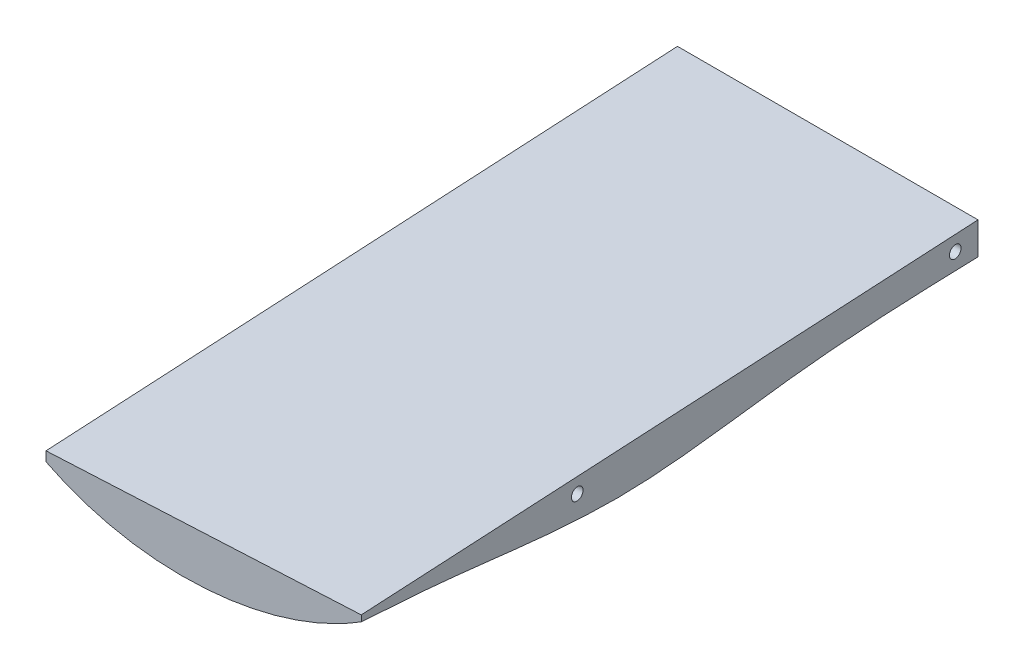
ISO-10303-21;
HEADER;
FILE_DESCRIPTION(('STEP AP214'),'2;1');
FILE_NAME('part.step','',(''),(''),'','','');
FILE_SCHEMA(('AUTOMOTIVE_DESIGN { 1 0 10303 214 1 1 1 1 }'));
ENDSEC;
DATA;
#1=APPLICATION_CONTEXT('core data for automotive mechanical design processes');
#2=APPLICATION_PROTOCOL_DEFINITION('international standard','automotive_design',2000,#1);
#3=PRODUCT_CONTEXT('',#1,'mechanical');
#4=PRODUCT('Part','Part','',(#3));
#5=PRODUCT_RELATED_PRODUCT_CATEGORY('part','',(#4));
#6=PRODUCT_DEFINITION_FORMATION('','',#4);
#7=PRODUCT_DEFINITION_CONTEXT('part definition',#1,'design');
#8=PRODUCT_DEFINITION('design','',#6,#7);
#9=PRODUCT_DEFINITION_SHAPE('','',#8);
#10=(LENGTH_UNIT() NAMED_UNIT(*) SI_UNIT(.MILLI.,.METRE.));
#11=(NAMED_UNIT(*) PLANE_ANGLE_UNIT() SI_UNIT($,.RADIAN.));
#12=(NAMED_UNIT(*) SI_UNIT($,.STERADIAN.) SOLID_ANGLE_UNIT());
#13=UNCERTAINTY_MEASURE_WITH_UNIT(LENGTH_MEASURE(1.E-05),#10,'distance_accuracy_value','');
#14=(GEOMETRIC_REPRESENTATION_CONTEXT(3) GLOBAL_UNCERTAINTY_ASSIGNED_CONTEXT((#13)) GLOBAL_UNIT_ASSIGNED_CONTEXT((#10,
#11,#12)) REPRESENTATION_CONTEXT('',''));
#15=CARTESIAN_POINT('',(0.,0.,0.));
#16=DIRECTION('',(0.,0.,1.));
#17=DIRECTION('',(1.,0.,0.));
#18=AXIS2_PLACEMENT_3D('',#15,#16,#17);
#19=CARTESIAN_POINT('',(35.8427346748158,-3.54190754826226,155.));
#20=CARTESIAN_POINT('',(35.1627526778447,-3.68514347465179,144.657982186078));
#21=CARTESIAN_POINT('',(33.7880147764098,-3.64195272906482,124.017509866304));
#22=CARTESIAN_POINT('',(30.314241494189,-3.05406172963305,93.0196051861016));
#23=CARTESIAN_POINT('',(29.4858974070119,-0.541565262780365,61.9867643142251));
#24=CARTESIAN_POINT('',(28.9585928296278,-3.02651502440856,30.9782382878208));
#25=CARTESIAN_POINT('',(30.8908482216009,-1.73391869803667,-0.00116580546392431));
#26=CARTESIAN_POINT('',(31.8951804742411,-1.35287675198569,-30.9970094182614));
#27=CARTESIAN_POINT('',(36.8141189130246,-4.09666569025635,-61.9641568609168));
#28=CARTESIAN_POINT('',(34.2834172353273,-4.63876904274589,-93.0171839677356));
#29=CARTESIAN_POINT('',(31.915203952217,-2.21704479511777,-113.734328828711));
#30=CARTESIAN_POINT('',(30.2130961084065,-0.426121435458513,-124.));
#31=CARTESIAN_POINT('',(35.8379122430388,-4.15463549946753,155.));
#32=CARTESIAN_POINT('',(35.1612340933614,-4.25417602949023,144.65817324007));
#33=CARTESIAN_POINT('',(33.7942466139428,-4.15930965899877,124.017421397679));
#34=CARTESIAN_POINT('',(30.2978104979273,-3.68417084458209,93.0196284449469));
#35=CARTESIAN_POINT('',(29.5254841303272,-1.23414851673452,61.9867595991212));
#36=CARTESIAN_POINT('',(28.9318746057494,-3.8033975346619,30.9782338761082));
#37=CARTESIAN_POINT('',(30.9126553470235,-2.61239013705044,-0.00114340155636377));
#38=CARTESIAN_POINT('',(31.9602453226888,-2.2593410670807,-30.9970946157675));
#39=CARTESIAN_POINT('',(36.819364156405,-5.09675061514111,-61.9638388881608));
#40=CARTESIAN_POINT('',(34.2621958190516,-5.55858362277206,-93.0183691821437));
#41=CARTESIAN_POINT('',(31.9282831337774,-3.20254926132649,-113.73176900778));
#42=CARTESIAN_POINT('',(30.2530375907749,-1.45383942767095,-124.));
#43=CARTESIAN_POINT('',(35.7578455538799,-5.36785163974602,155.));
#44=CARTESIAN_POINT('',(35.0866462414737,-5.38042763031314,144.65855016562));
#45=CARTESIAN_POINT('',(33.7329163681328,-5.1853268329877,124.017246867108));
#46=CARTESIAN_POINT('',(30.1913829249364,-4.93155169219905,93.0196743075292));
#47=CARTESIAN_POINT('',(29.5264106303809,-2.61060175832749,61.9867503866196));
#48=CARTESIAN_POINT('',(28.7970167939569,-5.34024721932651,30.9782248368355));
#49=CARTESIAN_POINT('',(30.8663872995961,-4.35520798728201,-0.0010979474740641));
#50=CARTESIAN_POINT('',(31.993125211566,-4.06085784553073,-30.9972673797487));
#51=CARTESIAN_POINT('',(36.7244299012955,-7.08011266468958,-61.9631941244981));
#52=CARTESIAN_POINT('',(34.1127201653266,-7.37928066578461,-93.0207724736001));
#53=CARTESIAN_POINT('',(31.8489158436014,-5.15554159371352,-113.726578390445));
#54=CARTESIAN_POINT('',(30.2299725203858,-3.49391307422487,-124.));
#55=CARTESIAN_POINT('',(35.4346511755766,-7.1453058951382,155.));
#56=CARTESIAN_POINT('',(34.768156589362,-7.03222109429824,144.659076456229));
#57=CARTESIAN_POINT('',(33.4280732208492,-6.69188713354031,124.017003198801));
#58=CARTESIAN_POINT('',(29.8196845372562,-6.75870690150582,93.0197382608096));
#59=CARTESIAN_POINT('',(29.30162917273,-4.64206488458172,61.9867378328055));
#60=CARTESIAN_POINT('',(28.3601505599028,-7.58779227086423,30.9782110598405));
#61=CARTESIAN_POINT('',(30.5374627522916,-6.9185830772304,-0.00103016178208137));
#62=CARTESIAN_POINT('',(31.7610895525783,-6.71966900715749,-30.9975247257979));
#63=CARTESIAN_POINT('',(36.2780794691328,-9.99551352097931,-61.9622337744127));
#64=CARTESIAN_POINT('',(33.5791070534056,-10.0437329265352,-93.0243520607695));
#65=CARTESIAN_POINT('',(31.4271996897202,-8.02467718861711,-113.718847219021));
#66=CARTESIAN_POINT('',(29.8979344610096,-6.49786328244929,-124.));
#67=CARTESIAN_POINT('',(34.9165335849583,-8.87473952687532,155.));
#68=CARTESIAN_POINT('',(34.2513560601391,-8.64028224655301,144.659554794846));
#69=CARTESIAN_POINT('',(32.9187989132671,-8.16146354042803,124.016781760941));
#70=CARTESIAN_POINT('',(29.2446006435911,-8.53604601241197,93.0197962855277));
#71=CARTESIAN_POINT('',(28.8592360759079,-6.63336493611029,61.9867267997543));
#72=CARTESIAN_POINT('',(27.6983978333539,-9.77059821007916,30.9781971298423));
#73=CARTESIAN_POINT('',(29.9591164006536,-9.42260368594222,-0.000963288906382638));
#74=CARTESIAN_POINT('',(31.258178862561,-9.32591867234625,-30.9977782675884));
#75=CARTESIAN_POINT('',(35.5397832106495,-12.8415563417304,-61.9612877099571));
#76=CARTESIAN_POINT('',(32.7489929280319,-12.6336496499087,-93.027878376228));
#77=CARTESIAN_POINT('',(30.7141388140568,-10.8231505676935,-113.711231107797));
#78=CARTESIAN_POINT('',(29.2798595994272,-9.43557998107364,-124.));
#79=CARTESIAN_POINT('',(30.6873155608603,-18.9293135635908,155.));
#80=CARTESIAN_POINT('',(30.0110030689528,-17.9962810735418,144.662205941936));
#81=CARTESIAN_POINT('',(28.6868187856497,-16.7267014182124,124.015554606319));
#82=CARTESIAN_POINT('',(24.6258783455123,-18.8666401384387,93.0201173787256));
#83=CARTESIAN_POINT('',(24.9505518208412,-18.298284965522,61.9866675180937));
#84=CARTESIAN_POINT('',(22.4367086609945,-22.4369800911767,30.9781129452956));
#85=CARTESIAN_POINT('',(25.053172867069,-24.0396530128959,-0.000566569112756719));
#86=CARTESIAN_POINT('',(26.6781138376736,-24.593146633283,-30.9992808440941));
#87=CARTESIAN_POINT('',(29.431221401857,-29.444563693327,-61.9556814115166));
#88=CARTESIAN_POINT('',(26.0634458780859,-27.6738308593843,-93.0487749165118));
#89=CARTESIAN_POINT('',(24.7626430641856,-27.1377788346257,-113.666098927189));
#90=CARTESIAN_POINT('',(23.9236115262114,-26.6040396272576,-124.));
#91=CARTESIAN_POINT('',(18.0914051072497,-25.5679590364641,155.));
#92=CARTESIAN_POINT('',(17.232825139579,-24.2156509058627,144.659597332812));
#93=CARTESIAN_POINT('',(15.6635832143728,-22.56145812675,124.016765028065));
#94=CARTESIAN_POINT('',(11.3001360733182,-25.6656174263986,93.0197911024135));
#95=CARTESIAN_POINT('',(11.6026575923168,-26.7087709690945,61.9867642010609));
#96=CARTESIAN_POINT('',(7.56884931317433,-30.6067826689803,30.9780524941291));
#97=CARTESIAN_POINT('',(9.37915809323674,-34.1667863806854,-0.000421401284486222));
#98=CARTESIAN_POINT('',(10.3145348593972,-35.6028435805808,-30.9998009985907));
#99=CARTESIAN_POINT('',(10.7578432540208,-40.85331256738,-61.9537484724272));
#100=CARTESIAN_POINT('',(6.70459549505113,-37.5051537947056,-93.0559775362772));
#101=CARTESIAN_POINT('',(6.2117993839457,-38.1883646280861,-113.650543141512));
#102=CARTESIAN_POINT('',(6.18604525358706,-38.6580590239778,-124.));
#103=CARTESIAN_POINT('',(-13.1751994720926,-25.2519318340484,155.));
#104=CARTESIAN_POINT('',(-14.4928220309325,-24.1100807881853,144.668342308697));
#105=CARTESIAN_POINT('',(-17.0125124288873,-22.8419752111193,124.012711461055));
#106=CARTESIAN_POINT('',(-21.4556354493319,-25.2773778653865,93.02087024127));
#107=CARTESIAN_POINT('',(-22.7635399151617,-28.6100869765786,61.986494465896));
#108=CARTESIAN_POINT('',(-28.7585158132102,-29.5891445412055,30.9780519833091));
#109=CARTESIAN_POINT('',(-30.2913873922654,-35.2350820588258,-0.00014873554086977));
#110=CARTESIAN_POINT('',(-32.2766559710149,-38.0880614379352,-31.0008911129428));
#111=CARTESIAN_POINT('',(-35.9026874663514,-41.8042082258472,-61.9496659908204));
#112=CARTESIAN_POINT('',(-41.0932728847451,-36.5550300750589,-93.0711983423471));
#113=CARTESIAN_POINT('',(-40.1246305535144,-38.9134863798661,-113.617668641055));
#114=CARTESIAN_POINT('',(-39.1298828653632,-40.4192282918993,-124.));
#115=CARTESIAN_POINT('',(-27.199405109194,-15.1602430058688,155.));
#116=CARTESIAN_POINT('',(-28.8227905014613,-14.8980451402706,144.683109718443));
#117=CARTESIAN_POINT('',(-31.8310522331261,-14.5330501655138,124.005864470315));
#118=CARTESIAN_POINT('',(-35.9686035728145,-14.8802305060615,93.0226989829466));
#119=CARTESIAN_POINT('',(-38.9054169810742,-18.2193372994629,61.9860151161056));
#120=CARTESIAN_POINT('',(-44.7100676174267,-16.5163081154681,30.9781402435583));
#121=CARTESIAN_POINT('',(-48.5388964368377,-21.4522634594427,-2.13854617520809E-05));
#122=CARTESIAN_POINT('',(-52.541680958005,-24.4916147606981,-31.0014888227997));
#123=CARTESIAN_POINT('',(-57.0405424176506,-25.9895790404722,-61.9474054462964));
#124=CARTESIAN_POINT('',(-62.2817689903941,-21.2084256965811,-93.0796322620442));
#125=CARTESIAN_POINT('',(-61.2921357370959,-23.2008902341755,-113.59945167089));
#126=CARTESIAN_POINT('',(-60.2177569634773,-24.526053889533,-124.));
#127=CARTESIAN_POINT('',(-27.0065078381165,9.34887504234193,155.));
#128=CARTESIAN_POINT('',(-28.7479835050662,8.03975050873394,144.684747742096));
#129=CARTESIAN_POINT('',(-32.0868523229509,6.07939228859313,124.005102716381));
#130=CARTESIAN_POINT('',(-35.3096014614367,10.3459994164792,93.0229097821866));
#131=CARTESIAN_POINT('',(-40.4894191387344,9.47823039578965,61.9859324352675));
#132=CARTESIAN_POINT('',(-43.6409679810289,14.5601722576259,30.9782602852745));
#133=CARTESIAN_POINT('',(-49.4121314320725,13.6876485154943,-0.000419321419992106));
#134=CARTESIAN_POINT('',(-55.14084607463,11.7615594746781,-31.000017266097));
#135=CARTESIAN_POINT('',(-57.2631008964266,14.0343302732412,-61.9528866139599));
#136=CARTESIAN_POINT('',(-61.3854054357999,15.5076024229043,-93.0592046325641));
#137=CARTESIAN_POINT('',(-61.9179058916334,16.3846492180172,-113.64357065152));
#138=CARTESIAN_POINT('',(-61.8154162582166,16.5826657989647,-124.));
#139=CARTESIAN_POINT('',(-12.8256940815717,19.1554816400401,155.));
#140=CARTESIAN_POINT('',(-14.3794971897764,17.1546878874907,144.671618356002));
#141=CARTESIAN_POINT('',(-17.4656788347286,14.6422203711915,124.011187953189));
#142=CARTESIAN_POINT('',(-20.2643945810951,20.3927309188514,93.0212918397498));
#143=CARTESIAN_POINT('',(-25.6326953299893,21.5840382585756,61.9863291042197));
#144=CARTESIAN_POINT('',(-26.82207802381,26.7155431439095,30.9782920667415));
#145=CARTESIAN_POINT('',(-31.8718924010995,28.4321300624706,-0.000944607457347031));
#146=CARTESIAN_POINT('',(-36.9921218538255,27.6074536873767,-30.9979479995374));
#147=CARTESIAN_POINT('',(-36.2832174240912,30.6784920919938,-61.9606283261474));
#148=CARTESIAN_POINT('',(-39.5538330002091,30.102417845161,-93.0303430833869));
#149=CARTESIAN_POINT('',(-41.0756082881029,32.5239395084448,-113.705906602314));
#150=CARTESIAN_POINT('',(-42.0246388803553,34.0645580690216,-124.));
#151=CARTESIAN_POINT('',(18.4409104977706,18.8394544376244,155.));
#152=CARTESIAN_POINT('',(17.3399803275693,16.9740913441582,144.656834301682));
#153=CARTESIAN_POINT('',(15.2132798577956,14.9575250299903,124.01804013556));
#154=CARTESIAN_POINT('',(12.4906043315148,19.9951963084886,93.0194698646857));
#155=CARTESIAN_POINT('',(8.73373429456203,23.487804662086,61.9867762351576));
#156=CARTESIAN_POINT('',(9.50513123580112,25.6974004171582,30.9783260951987));
#157=CARTESIAN_POINT('',(7.79904460964687,29.4999887383663,-0.0015295223582621));
#158=CARTESIAN_POINT('',(5.59765891401819,30.0949244744353,-30.995642474396));
#159=CARTESIAN_POINT('',(10.3825552111577,31.6208241984226,-61.969254293763));
#160=CARTESIAN_POINT('',(8.22450214332878,29.1842553960001,-92.9981848871404));
#161=CARTESIAN_POINT('',(5.30300845642453,33.1800240101548,-113.775362756683));
#162=CARTESIAN_POINT('',(3.29128923859487,35.8257273369431,-124.));
#163=CARTESIAN_POINT('',(30.9303274301597,11.9472590209008,155.));
#164=CARTESIAN_POINT('',(30.0867219173147,10.6673470565356,144.653195838053));
#165=CARTESIAN_POINT('',(28.3731581158383,9.34905904961438,124.019726529547));
#166=CARTESIAN_POINT('',(25.4537675305107,12.8844351785463,93.0190213867381));
#167=CARTESIAN_POINT('',(22.9557300374721,16.6027143751478,61.9868865615673));
#168=CARTESIAN_POINT('',(23.7830681528223,16.7115931136574,30.9783334079898));
#169=CARTESIAN_POINT('',(23.9543357891842,20.2281865547234,-0.00166950551863694));
#170=CARTESIAN_POINT('',(23.3991238601176,21.0857446068253,-30.9950898792864));
#171=CARTESIAN_POINT('',(29.1678095923344,20.9503161704363,-61.9713220019487));
#172=CARTESIAN_POINT('',(27.1294573711835,18.6825799467348,-92.9904762737712));
#173=CARTESIAN_POINT('',(24.1108520771063,22.5126453644955,-113.792012041356));
#174=CARTESIAN_POINT('',(21.9108812809911,25.1847013964155,-124.));
#175=CARTESIAN_POINT('',(35.0006176051836,1.80879770595725,155.));
#176=CARTESIAN_POINT('',(34.2775216582262,1.27717800295542,144.656297125633));
#177=CARTESIAN_POINT('',(32.8102854944179,0.861131458024565,124.018290207689));
#178=CARTESIAN_POINT('',(29.5310526154605,2.45002886467455,93.0193998213985));
#179=CARTESIAN_POINT('',(28.1690132344922,5.44266812407294,61.9868067393754));
#180=CARTESIAN_POINT('',(28.1642482132528,3.77511363932708,30.9782740644777));
#181=CARTESIAN_POINT('',(29.5789113380691,5.89441578140652,-0.00135169119266476));
#182=CARTESIAN_POINT('',(30.1236182439897,6.47934643158998,-30.9963017045752));
#183=CARTESIAN_POINT('',(35.448656483217,4.59543426479071,-61.9667983959258));
#184=CARTESIAN_POINT('',(33.1177823088361,3.40616278703331,-93.0073378292235));
#185=CARTESIAN_POINT('',(30.4887414009784,6.35600786229482,-113.755594486328));
#186=CARTESIAN_POINT('',(28.5834390865734,8.48373219173645,-124.));
#187=CARTESIAN_POINT('',(35.491432166004,0.06916629260821,155.));
#188=CARTESIAN_POINT('',(34.7858309120324,-0.334971455850413,144.656834954274));
#189=CARTESIAN_POINT('',(33.3547930148483,-0.599077144150035,124.018041131195));
#190=CARTESIAN_POINT('',(30.0131229576796,0.660078002559681,93.0194654080247));
#191=CARTESIAN_POINT('',(28.8355292482874,3.51274076275009,61.98679305209));
#192=CARTESIAN_POINT('',(28.6747343323762,1.55947475458338,30.9782631918696));
#193=CARTESIAN_POINT('',(30.280713724203,3.42482826003675,-0.00129440330500312));
#194=CARTESIAN_POINT('',(30.9949366498529,3.95344419683371,-30.9965199674317));
#195=CARTESIAN_POINT('',(36.2165311281582,1.77950485105571,-61.965983691515));
#196=CARTESIAN_POINT('',(33.8281891826456,0.787714417747922,-93.0103745941404));
#197=CARTESIAN_POINT('',(31.2748988775122,3.5763380002292,-113.749035689507));
#198=CARTESIAN_POINT('',(29.4276495439955,5.60284610591571,-124.));
#199=CARTESIAN_POINT('',(35.7865986987834,-1.71453804562608,155.));
#200=CARTESIAN_POINT('',(35.0955763026155,-1.98928641439416,144.65740384167));
#201=CARTESIAN_POINT('',(33.6958175118038,-2.09988870001354,124.017777678858));
#202=CARTESIAN_POINT('',(30.2893350857342,-1.17480875780901,93.0195347544575));
#203=CARTESIAN_POINT('',(29.2903845349913,1.51889271462072,61.9867786772427));
#204=CARTESIAN_POINT('',(28.9563173298102,-0.708193523111859,30.9782513071107));
#205=CARTESIAN_POINT('',(30.7363743719684,0.882557587657773,-0.00123237091941341));
#206=CARTESIAN_POINT('',(31.6051504426317,1.34387387831209,-30.9967561947125));
#207=CARTESIAN_POINT('',(36.6932813760123,-1.11742870692895,-61.9651019610341));
#208=CARTESIAN_POINT('',(34.2387822268579,-1.89426622722135,-93.0136611871519));
#209=CARTESIAN_POINT('',(31.7719435671115,0.718816938458442,-113.741937316033));
#210=CARTESIAN_POINT('',(29.9918264390473,2.6337266139694,-124.));
#211=CARTESIAN_POINT('',(35.8475571065927,-2.92917959705699,155.));
#212=CARTESIAN_POINT('',(35.164271262328,-3.11611091981335,144.657791132086));
#213=CARTESIAN_POINT('',(33.7817829388768,-3.12459579913088,124.017598334929));
#214=CARTESIAN_POINT('',(30.3306724904507,-2.423952614684,93.0195819272563));
#215=CARTESIAN_POINT('',(29.4463106836965,0.151017991173795,61.9867690293289));
#216=CARTESIAN_POINT('',(28.9853110535062,-2.24963251415523,30.9782426995333));
#217=CARTESIAN_POINT('',(30.8690410961782,-0.855447259022891,-0.00118820937148485));
#218=CARTESIAN_POINT('',(31.8301156257933,-0.446412436890691,-30.9969242207554));
#219=CARTESIAN_POINT('',(36.8088736696442,-3.0965807653716,-61.9644748336728));
#220=CARTESIAN_POINT('',(34.3046386516031,-3.71895446271972,-93.0159987533276));
#221=CARTESIAN_POINT('',(31.9021247706566,-1.23154032890905,-113.736888649643));
#222=CARTESIAN_POINT('',(30.173154626038,0.601596556753926,-124.));
#223=CARTESIAN_POINT('',(35.8427346748158,-3.54190754826226,155.));
#224=CARTESIAN_POINT('',(35.1627526778447,-3.68514347465179,144.657982186078));
#225=CARTESIAN_POINT('',(33.7880147764098,-3.64195272906482,124.017509866304));
#226=CARTESIAN_POINT('',(30.314241494189,-3.05406172963305,93.0196051861016));
#227=CARTESIAN_POINT('',(29.4858974070119,-0.541565262780365,61.9867643142251));
#228=CARTESIAN_POINT('',(28.9585928296278,-3.02651502440856,30.9782382878208));
#229=CARTESIAN_POINT('',(30.8908482216009,-1.73391869803667,-0.00116580546392431));
#230=CARTESIAN_POINT('',(31.8951804742411,-1.35287675198569,-30.9970094182614));
#231=CARTESIAN_POINT('',(36.8141189130246,-4.09666569025635,-61.9641568609168));
#232=CARTESIAN_POINT('',(34.2834172353273,-4.63876904274589,-93.0171839677356));
#233=CARTESIAN_POINT('',(31.915203952217,-2.21704479511777,-113.734328828711));
#234=CARTESIAN_POINT('',(30.2130961084065,-0.426121435458513,-124.));
#235=B_SPLINE_SURFACE_WITH_KNOTS('',3,3,((#19,#20,#21,#22,#23,#24,#25,#26,#27,#28,#29,#30),(#31,
#32,#33,#34,#35,#36,#37,#38,#39,#40,#41,#42),(#43,#44,#45,#46,#47,#48,#49,#50,#51,#52,#53,#54),
(#55,#56,#57,#58,#59,#60,#61,#62,#63,#64,#65,#66),(#67,#68,#69,#70,#71,#72,#73,#74,#75,#76,#77,
#78),(#79,#80,#81,#82,#83,#84,#85,#86,#87,#88,#89,#90),(#91,#92,#93,#94,#95,#96,#97,#98,#99,
#100,#101,#102),(#103,#104,#105,#106,#107,#108,#109,#110,#111,#112,#113,#114),(#115,#116,#117,
#118,#119,#120,#121,#122,#123,#124,#125,#126),(#127,#128,#129,#130,#131,#132,#133,#134,#135,
#136,#137,#138),(#139,#140,#141,#142,#143,#144,#145,#146,#147,#148,#149,#150),(#151,#152,#153,
#154,#155,#156,#157,#158,#159,#160,#161,#162),(#163,#164,#165,#166,#167,#168,#169,#170,#171,
#172,#173,#174),(#175,#176,#177,#178,#179,#180,#181,#182,#183,#184,#185,#186),(#187,#188,#189,
#190,#191,#192,#193,#194,#195,#196,#197,#198),(#199,#200,#201,#202,#203,#204,#205,#206,#207,
#208,#209,#210),(#211,#212,#213,#214,#215,#216,#217,#218,#219,#220,#221,#222),(#223,#224,#225,
#226,#227,#228,#229,#230,#231,#232,#233,#234)),.UNSPECIFIED.,.T.,.F.,.F.,(4,1,1,1,1,2,2,2,1,1,1,
1,4),(4,1,1,1,1,1,1,1,1,4),(0.,0.0125,0.0249999999999999,0.0375000000000001,0.05,0.25,0.5,0.75,
0.95,0.9625,0.975,0.9875,1.),(0.,0.111186009309614,0.22227899560327,0.333246583960217,
0.444296507320463,0.555487388383461,0.666700226573109,0.77787064216206,0.888814058395876,1.),.UNSPECIFIED.);
#236=CARTESIAN_POINT('',(15.3073302178123,-28.5967891890633,-14.6365276553906));
#237=CARTESIAN_POINT('',(15.2123436249481,-28.7990278504998,-16.4668833844653));
#238=CARTESIAN_POINT('',(15.1173704537612,-29.0046389443827,-18.2969804828953));
#239=CARTESIAN_POINT('',(14.9274453542363,-29.4327886362347,-21.9567653380878));
#240=CARTESIAN_POINT('',(14.8324935130789,-29.6553415198714,-23.7864514149151));
#241=CARTESIAN_POINT('',(14.7059939628873,-29.9699839833801,-26.2240499163124));
#242=CARTESIAN_POINT('',(14.674367196046,-30.0501642132366,-26.8334857549363));
#243=CARTESIAN_POINT('',(14.6111368846187,-30.2138573534635,-28.0519099481024));
#244=CARTESIAN_POINT('',(14.5795333399938,-30.2973702582225,-28.6608983033963));
#245=CARTESIAN_POINT('',(14.5163533773461,-30.4680974630276,-29.8783522946171));
#246=CARTESIAN_POINT('',(14.484776959052,-30.5553117255964,-30.486817935773));
#247=CARTESIAN_POINT('',(14.4216455753244,-30.73376592947,-31.7033358295715));
#248=CARTESIAN_POINT('',(14.3900906185308,-30.8250070070744,-32.3113879157277));
#249=CARTESIAN_POINT('',(14.3270038840662,-31.0104490752208,-33.5270454351115));
#250=CARTESIAN_POINT('',(14.2954721066085,-31.1046500926638,-34.1346508642284));
#251=CARTESIAN_POINT('',(14.2324246185276,-31.2950454421691,-35.3495521206381));
#252=CARTESIAN_POINT('',(14.2009089079861,-31.3912397842771,-35.9568479463547));
#253=CARTESIAN_POINT('',(14.0748783894189,-31.7780117086894,-38.3854083856975));
#254=CARTESIAN_POINT('',(13.9803971746967,-32.0726721567124,-40.2060256690669));
#255=CARTESIAN_POINT('',(13.8543594371205,-32.4547899552243,-42.6347252159822));
#256=CARTESIAN_POINT('',(13.8228613778945,-32.5493735970028,-43.2416809075234));
#257=CARTESIAN_POINT('',(13.7598438701894,-32.7358535421115,-44.4560044534282));
#258=CARTESIAN_POINT('',(13.7283244217264,-32.8277498474778,-45.0633723074793));
#259=CARTESIAN_POINT('',(13.665257734146,-33.0079406429474,-46.278643530984));
#260=CARTESIAN_POINT('',(13.6337104949845,-33.0962351273252,-46.8865469012874));
#261=CARTESIAN_POINT('',(13.5705201977762,-33.2684813850598,-48.1042000355833));
#262=CARTESIAN_POINT('',(13.5388770738342,-33.3524241899138,-48.7139510693522));
#263=CARTESIAN_POINT('',(13.4755530797552,-33.5148596038761,-49.9341804917945));
#264=CARTESIAN_POINT('',(13.4438722095565,-33.5933522040548,-50.5446588816578));
#265=CARTESIAN_POINT('',(13.3804692755264,-33.7439666376136,-51.7664094471109));
#266=CARTESIAN_POINT('',(13.3487472112149,-33.8160883960644,-52.3776816319509));
#267=CARTESIAN_POINT('',(13.2853345637197,-33.9528756642831,-53.5996193722025));
#268=CARTESIAN_POINT('',(13.2536440793399,-34.0175581518336,-54.2102830237008));
#269=CARTESIAN_POINT('',(13.1902209875413,-34.1387394322322,-55.4324220217308));
#270=CARTESIAN_POINT('',(13.1584883802374,-34.1952382473546,-56.0438973660486));
#271=CARTESIAN_POINT('',(13.0949831688082,-34.2991261694017,-57.2676187783095));
#272=CARTESIAN_POINT('',(13.0632105650202,-34.346515352647,-57.8798648397522));
#273=CARTESIAN_POINT('',(12.9996851252348,-34.4311963404028,-59.1039760447886));
#274=CARTESIAN_POINT('',(12.9679323527028,-34.4685057520173,-59.715839965427));
#275=CARTESIAN_POINT('',(12.9043970391179,-34.5321885972351,-60.9401414348453));
#276=CARTESIAN_POINT('',(12.8726144980875,-34.5585620390847,-61.5525789831923));
#277=CARTESIAN_POINT('',(12.8090297545534,-34.5995962101192,-62.777832949043));
#278=CARTESIAN_POINT('',(12.777227552407,-34.6142571462599,-63.3906493596609));
#279=CARTESIAN_POINT('',(12.7136101703095,-34.6330369281139,-64.6165322582871));
#280=CARTESIAN_POINT('',(12.6817949891013,-34.6371541057282,-65.2295987705204));
#281=CARTESIAN_POINT('',(12.6181643897724,-34.6358898592653,-66.455736360197));
#282=CARTESIAN_POINT('',(12.5863489716758,-34.6305081365628,-67.0688074371779));
#283=CARTESIAN_POINT('',(12.5227249040562,-34.6113190978271,-68.294819163288));
#284=CARTESIAN_POINT('',(12.4909162546037,-34.5975116978068,-68.9077598110561));
#285=CARTESIAN_POINT('',(12.4272708711936,-34.5625022619813,-70.1341822843895));
#286=CARTESIAN_POINT('',(12.3954341509313,-34.5412911346608,-70.7476638460493));
#287=CARTESIAN_POINT('',(12.3317746344827,-34.4925210487403,-71.97435865769));
#288=CARTESIAN_POINT('',(12.2999518380151,-34.4649622249296,-72.5875719130911));
#289=CARTESIAN_POINT('',(12.2363200889219,-34.4045211679363,-73.8137316582918));
#290=CARTESIAN_POINT('',(12.2045111362486,-34.3716389532575,-74.4266781490111));
#291=CARTESIAN_POINT('',(12.1408833308345,-34.3015326012691,-75.652761901007));
#292=CARTESIAN_POINT('',(12.1090644873409,-34.2643053685546,-76.2658989840931));
#293=CARTESIAN_POINT('',(12.0454378196399,-34.1865195528949,-77.4919608127868));
#294=CARTESIAN_POINT('',(12.0136299954371,-34.1459609685848,-78.1048855583073));
#295=CARTESIAN_POINT('',(11.9500226301744,-34.0624880178718,-79.3305754363146));
#296=CARTESIAN_POINT('',(11.9182230891355,-34.0195736455405,-79.9433405683959));
#297=CARTESIAN_POINT('',(11.8239606588337,-33.8902913510483,-81.7597419587092));
#298=CARTESIAN_POINT('',(11.7615051738463,-33.8019344694502,-82.9632355393487));
#299=CARTESIAN_POINT('',(11.6678158766262,-33.6707737520189,-84.7685928718836));
#300=CARTESIAN_POINT('',(11.6365846342392,-33.6272819764195,-85.3704071038249));
#301=CARTESIAN_POINT('',(11.5741170785291,-33.5416503557116,-86.5741332827268));
#302=CARTESIAN_POINT('',(11.5428807651977,-33.499510512858,-87.1760452298488));
#303=CARTESIAN_POINT('',(11.4804039826516,-33.4174870226274,-88.3799492063909));
#304=CARTESIAN_POINT('',(11.4491635144195,-33.3776030986196,-88.9819412168794));
#305=CARTESIAN_POINT('',(11.386672211277,-33.3009811634495,-90.1861249998231));
#306=CARTESIAN_POINT('',(11.355421376391,-33.2642431450071,-90.7883167718129));
#307=CARTESIAN_POINT('',(11.2929118907305,-33.19485621691,-91.9928509250044));
#308=CARTESIAN_POINT('',(11.261653241722,-33.1622067210269,-92.5951932721776));
#309=CARTESIAN_POINT('',(11.1991231761708,-33.1018179193631,-93.8001239920833));
#310=CARTESIAN_POINT('',(11.167851759627,-33.0740786139722,-94.4027123648353));
#311=CARTESIAN_POINT('',(11.1052996650847,-33.0231585640335,-95.6080675750683));
#312=CARTESIAN_POINT('',(11.07401898729,-32.9999777257197,-96.2108344086229));
#313=CARTESIAN_POINT('',(11.0114498392578,-32.9579149636817,-97.4165182331585));
#314=CARTESIAN_POINT('',(10.980161369006,-32.93903304793,-98.0194352244159));
#315=CARTESIAN_POINT('',(10.9175761858153,-32.9052901188857,-99.2254280403923));
#316=CARTESIAN_POINT('',(10.8862794724235,-32.8904294198187,-99.8285038738399));
#317=CARTESIAN_POINT('',(10.82368194232,-32.8644656405359,-101.034734610158));
#318=CARTESIAN_POINT('',(10.792381125612,-32.8533625569701,-101.637889512958));
#319=CARTESIAN_POINT('',(10.6984496347452,-32.8252872708061,-103.44791382549));
#320=CARTESIAN_POINT('',(10.6358146360684,-32.8135619417547,-104.654866567048));
#321=CARTESIAN_POINT('',(10.5105209899299,-32.8020408849127,-107.069227753308));
#322=CARTESIAN_POINT('',(10.4478623416511,-32.8022492036973,-108.276636213756));
#323=CARTESIAN_POINT('',(10.3225096527301,-32.8125947602154,-110.69213513211));
#324=CARTESIAN_POINT('',(10.2598156135588,-32.8227379922235,-111.900225561674));
#325=CARTESIAN_POINT('',(10.1343807102009,-32.8509771286306,-114.317308721139));
#326=CARTESIAN_POINT('',(10.0716398501754,-32.869079603949,-115.526301370858));
#327=CARTESIAN_POINT('',(9.94609987356027,-32.9112625009926,-117.94540925227));
#328=CARTESIAN_POINT('',(9.88330076266146,-32.9353489874692,-119.155524374302));
#329=CARTESIAN_POINT('',(9.75763257259972,-32.9874862787753,-121.577102880322));
#330=CARTESIAN_POINT('',(9.69476349855764,-33.0155417400145,-122.788566165633));
#331=CARTESIAN_POINT('',(9.63189595287463,-33.0445474254916,-124.));
#332=B_SPLINE_CURVE_WITH_KNOTS('',3,(#236,#237,#238,#239,#240,#241,#242,#243,#244,#245,#246,
#247,#248,#249,#250,#251,#252,#253,#254,#255,#256,#257,#258,#259,#260,#261,#262,#263,#264,#265,
#266,#267,#268,#269,#270,#271,#272,#273,#274,#275,#276,#277,#278,#279,#280,#281,#282,#283,#284,
#285,#286,#287,#288,#289,#290,#291,#292,#293,#294,#295,#296,#297,#298,#299,#300,#301,#302,#303,
#304,#305,#306,#307,#308,#309,#310,#311,#312,#313,#314,#315,#316,#317,#318,#319,#320,#321,#322,
#323,#324,#325,#326,#327,#328,#329,#330,#331),.UNSPECIFIED.,.F.,.F.,(4,2,2,2,2,2,2,2,2,2,2,2,2,
2,2,2,2,2,2,2,2,2,2,2,2,2,2,2,2,2,2,2,2,2,2,2,2,2,2,2,2,2,2,2,2,2,2,4),(0.,5.53201248736777,
11.0687424835384,12.9152352991277,14.7617250058967,16.608196020888,18.4551914526923,
20.3022036755242,22.1492252089298,27.6893800735708,29.5346396798062,31.3798978878981,
33.2251590290954,35.0740831400125,36.9230102801752,38.7719591632153,40.6166009652106,
42.4612377463431,44.3058590724208,46.1472371136774,47.98861376642,49.8299578819733,
51.6715932935094,53.513286603196,55.3549982711796,57.1989794987062,59.0429215740706,
60.8868572401649,62.7321146435758,64.5773728029671,66.4226356060834,70.0476757140286,
71.8602497409291,73.6728267909914,75.4851810908434,77.2975311966059,79.1096211422282,
80.9217112317122,82.7337640432513,84.5458202152028,86.3580179438168,88.1702140568187,
91.7960374541293,95.4230903375562,99.052332968595,102.684577439084,106.320518288506,
109.960760762921),.UNSPECIFIED.);
#333=CARTESIAN_POINT('',(15.2557711875427,-28.7069458493462,-15.6300506736802));
#334=VERTEX_POINT('',#333);
#335=CARTESIAN_POINT('',(9.63188972473615,-33.0487789764766,-124.));
#336=VERTEX_POINT('',#335);
#337=EDGE_CURVE('E12',#334,#336,#332,.T.);
#338=CARTESIAN_POINT('',(-34.6770364752115,-29.2871604394805,-13.0387732060134));
#339=CARTESIAN_POINT('',(-33.9126724173493,-29.7363664286074,-13.0784347997075));
#340=CARTESIAN_POINT('',(-33.1340299955951,-30.1609160756918,-13.1188376565536));
#341=CARTESIAN_POINT('',(-31.5528509270426,-30.9607451601901,-13.2008839347595));
#342=CARTESIAN_POINT('',(-30.7503387833589,-31.3360731202271,-13.242526083965));
#343=CARTESIAN_POINT('',(-29.1247486129555,-32.0383056241245,-13.3268782122711));
#344=CARTESIAN_POINT('',(-28.3016756892033,-32.3652220463745,-13.369587926415));
#345=CARTESIAN_POINT('',(-26.6425345349834,-32.9696433233155,-13.4556823198043));
#346=CARTESIAN_POINT('',(-25.8065568294563,-33.2473977564255,-13.4990622983565));
#347=CARTESIAN_POINT('',(-24.1203473065697,-33.7561242153917,-13.5865625160307));
#348=CARTESIAN_POINT('',(-23.2701123640461,-33.9870858352714,-13.6306829174539));
#349=CARTESIAN_POINT('',(-21.5583946377625,-34.4026528190505,-13.7195079650635));
#350=CARTESIAN_POINT('',(-20.6969113091544,-34.5872559286134,-13.764212639551));
#351=CARTESIAN_POINT('',(-18.9690061108341,-34.9099220097792,-13.8538788133132));
#352=CARTESIAN_POINT('',(-18.1026194582002,-35.0481745160445,-13.8988384827994));
#353=CARTESIAN_POINT('',(-16.3639574395092,-35.2796857747067,-13.9890639380074));
#354=CARTESIAN_POINT('',(-15.4916825788074,-35.372948339808,-14.0343296974596));
#355=CARTESIAN_POINT('',(-13.7435463233442,-35.5150328214585,-14.1250478542476));
#356=CARTESIAN_POINT('',(-12.8676848996689,-35.5638543790255,-14.170500253088));
#357=CARTESIAN_POINT('',(-11.1120623676397,-35.6176934241595,-14.2616079322872));
#358=CARTESIAN_POINT('',(-10.2322972997471,-35.6225840901761,-14.3072634195942));
#359=CARTESIAN_POINT('',(-8.91334562754907,-35.5973137444258,-14.3757109124097));
#360=CARTESIAN_POINT('',(-8.47378967169996,-35.5834544361646,-14.3985218968751));
#361=CARTESIAN_POINT('',(-7.59516100224907,-35.5449105025265,-14.4441189131157));
#362=CARTESIAN_POINT('',(-7.15608827939961,-35.5202260880535,-14.4669049453684));
#363=CARTESIAN_POINT('',(-5.83994624067435,-35.4298108752698,-14.5352073854993));
#364=CARTESIAN_POINT('',(-4.96393150871708,-35.3477177002387,-14.580669254883));
#365=CARTESIAN_POINT('',(-3.3594706494786,-35.1564424554079,-14.6639352115488));
#366=CARTESIAN_POINT('',(-2.63022814259916,-35.0538501638014,-14.7017805508342));
#367=CARTESIAN_POINT('',(-1.17678833239794,-34.8175620851234,-14.7772097676327));
#368=CARTESIAN_POINT('',(-0.452590875619751,-34.6838672483971,-14.8147936530984));
#369=CARTESIAN_POINT('',(0.98942222753318,-34.3851403105709,-14.8896306015435));
#370=CARTESIAN_POINT('',(1.70723722608886,-34.2201050655873,-14.9268836309406));
#371=CARTESIAN_POINT('',(3.13515067704131,-33.8584531240063,-15.0009896037557));
#372=CARTESIAN_POINT('',(3.84524590078944,-33.6618237181641,-15.0378423797695));
#373=CARTESIAN_POINT('',(5.95561241408972,-33.0260223181382,-15.1473675312186));
#374=CARTESIAN_POINT('',(7.34203805240281,-32.5396867462976,-15.2193219300949));
#375=CARTESIAN_POINT('',(10.0632131077282,-31.4397757565424,-15.3605504544436));
#376=CARTESIAN_POINT('',(11.3979874723922,-30.8262626993246,-15.4298258738566));
#377=CARTESIAN_POINT('',(13.133094423044,-29.922719340651,-15.5198799699999));
#378=CARTESIAN_POINT('',(13.563462181211,-29.6895266781271,-15.5422166690535));
#379=CARTESIAN_POINT('',(14.4159055986709,-29.208934792004,-15.5864599117701));
#380=CARTESIAN_POINT('',(14.837985593567,-28.9615432772237,-15.6083666803407));
#381=CARTESIAN_POINT('',(15.2557711875427,-28.7069458493463,-15.6300506736802));
#382=B_SPLINE_CURVE_WITH_KNOTS('',3,(#338,#339,#340,#341,#342,#343,#344,#345,#346,#347,#348,
#349,#350,#351,#352,#353,#354,#355,#356,#357,#358,#359,#360,#361,#362,#363,#364,#365,#366,#367,
#368,#369,#370,#371,#372,#373,#374,#375,#376,#377,#378,#379,#380,#381),.UNSPECIFIED.,.F.,.F.,(4,
2,2,2,2,2,2,2,2,2,2,2,2,2,2,2,2,2,2,2,2,4),(0.,2.66175001593424,5.32085603843426,
7.97930853037832,10.6238516491579,13.2689822282381,15.9142414106762,18.548547896948,
21.1826310978217,23.8167355759018,26.4584418626012,27.7794236595869,29.1003797212423,
31.7422271787405,33.9537893801475,36.165284015656,38.3770006124751,40.5896091445614,
44.9962665176396,49.4007682030693,50.8705362731541,52.3395137917392),.UNSPECIFIED.);
#383=CARTESIAN_POINT('',(-34.6770364752115,-29.2871604394805,-13.0387732060134));
#384=VERTEX_POINT('',#383);
#385=EDGE_CURVE('E167',#384,#334,#382,.T.);
#386=CARTESIAN_POINT('',(-40.4353864537231,-33.6893367093146,-124.));
#387=CARTESIAN_POINT('',(-40.3685678851181,-33.6231165037923,-122.712431447787));
#388=CARTESIAN_POINT('',(-40.3017521579901,-33.5557721599869,-121.424917649754));
#389=CARTESIAN_POINT('',(-40.1682089668843,-33.4226582681122,-118.851590851216));
#390=CARTESIAN_POINT('',(-40.1014815083294,-33.3568866753333,-117.565777955206));
#391=CARTESIAN_POINT('',(-39.9680944303703,-33.23061504381,-114.995459397973));
#392=CARTESIAN_POINT('',(-39.9014348274079,-33.170108677677,-113.710954053576));
#393=CARTESIAN_POINT('',(-39.7681633861901,-33.0579987924905,-111.142863772625));
#394=CARTESIAN_POINT('',(-39.701551568782,-33.0063862341718,-109.859279237789));
#395=CARTESIAN_POINT('',(-39.5683557529081,-32.9156002354882,-107.292646228621));
#396=CARTESIAN_POINT('',(-39.5017717723473,-32.8764172755417,-106.009598099309));
#397=CARTESIAN_POINT('',(-39.3686121896234,-32.8139036215714,-103.443663289239));
#398=CARTESIAN_POINT('',(-39.3020365963984,-32.7905660445144,-102.160776780717));
#399=CARTESIAN_POINT('',(-39.1687952633357,-32.7629862913495,-99.5932666725308));
#400=CARTESIAN_POINT('',(-39.1021295095056,-32.7587665886049,-98.308642803239));
#401=CARTESIAN_POINT('',(-39.0021396509298,-32.7691172852489,-96.3818760356857));
#402=CARTESIAN_POINT('',(-38.9688129267236,-32.7753467869243,-95.7396826614128));
#403=CARTESIAN_POINT('',(-38.9021638523234,-32.7937047238845,-94.4553801984287));
#404=CARTESIAN_POINT('',(-38.8688415021089,-32.8058331303902,-93.8132711093215));
#405=CARTESIAN_POINT('',(-38.8022015769088,-32.8363918854171,-92.5291449479639));
#406=CARTESIAN_POINT('',(-38.7688840026364,-32.8548228088718,-91.887127889456));
#407=CARTESIAN_POINT('',(-38.7022580295378,-32.8970712186091,-90.6032705798167));
#408=CARTESIAN_POINT('',(-38.6689496307582,-32.9208887318306,-89.9614303295857));
#409=CARTESIAN_POINT('',(-38.5690211039881,-32.998899600494,-88.0358454027397));
#410=CARTESIAN_POINT('',(-38.5024148686134,-33.0596423579432,-86.7523684315782));
#411=CARTESIAN_POINT('',(-38.3692139508508,-33.1906197313559,-84.1856371109423));
#412=CARTESIAN_POINT('',(-38.3026192743811,-33.2608564677761,-82.9023828755097));
#413=CARTESIAN_POINT('',(-38.1694316513667,-33.402907556461,-80.3359077396465));
#414=CARTESIAN_POINT('',(-38.1028387050097,-33.4747219743204,-79.0526868428312));
#415=CARTESIAN_POINT('',(-37.9887543407412,-33.5924411832533,-76.8543242798596));
#416=CARTESIAN_POINT('',(-37.9412672226565,-33.6398657591936,-75.9392654697396));
#417=CARTESIAN_POINT('',(-37.8462778549333,-33.7288110012331,-74.1088562701802));
#418=CARTESIAN_POINT('',(-37.7987756053062,-33.7703316717531,-73.1935058809596));
#419=CARTESIAN_POINT('',(-37.7037829390851,-33.8447227405494,-71.3630331205924));
#420=CARTESIAN_POINT('',(-37.6562925343147,-33.8775986474194,-70.4479109772826));
#421=CARTESIAN_POINT('',(-37.5612933695338,-33.9320605103375,-68.6173129921249));
#422=CARTESIAN_POINT('',(-37.5137846094661,-33.9536464309573,-67.701837149176));
#423=CARTESIAN_POINT('',(-37.4425315398093,-33.9755846302882,-66.3288174384149));
#424=CARTESIAN_POINT('',(-37.4187914400836,-33.9811571094747,-65.8713546930779));
#425=CARTESIAN_POINT('',(-37.3713095951887,-33.9885032707489,-64.9563974953329));
#426=CARTESIAN_POINT('',(-37.34756785002,-33.9902769537637,-64.4989030429328));
#427=CARTESIAN_POINT('',(-37.3000848377214,-33.9897208521962,-63.5839233497568));
#428=CARTESIAN_POINT('',(-37.27634357059,-33.987391136693,-63.1264381089556));
#429=CARTESIAN_POINT('',(-37.2288633524163,-33.9782555545224,-62.2115122575118));
#430=CARTESIAN_POINT('',(-37.2051244013697,-33.9714496961642,-61.754071646788));
#431=CARTESIAN_POINT('',(-37.1576521637336,-33.9533370022313,-60.8392995772855));
#432=CARTESIAN_POINT('',(-37.1339188769427,-33.9420303622817,-60.3819681146271));
#433=CARTESIAN_POINT('',(-37.0864587115426,-33.9152152281308,-59.4674286725495));
#434=CARTESIAN_POINT('',(-37.062731832951,-33.8997067225729,-59.0102206934673));
#435=CARTESIAN_POINT('',(-36.9915621961858,-33.8472215624995,-57.6388087029805));
#436=CARTESIAN_POINT('',(-36.9441310145282,-33.8042854968973,-56.7248277666603));
#437=CARTESIAN_POINT('',(-36.8492737593266,-33.704409635078,-54.8969643254406));
#438=CARTESIAN_POINT('',(-36.8018477156908,-33.6474594710115,-53.9830823968573));
#439=CARTESIAN_POINT('',(-36.7070397099846,-33.5214406998697,-52.1561679747896));
#440=CARTESIAN_POINT('',(-36.6596577475588,-33.4523721913543,-51.2431354744574));
#441=CARTESIAN_POINT('',(-36.517496113074,-33.2296196197851,-48.503734530725));
#442=CARTESIAN_POINT('',(-36.4227815294329,-33.0604798960119,-46.6786203165275));
#443=CARTESIAN_POINT('',(-36.280884694497,-32.7866115806599,-43.9443219599805));
#444=CARTESIAN_POINT('',(-36.2336474836388,-32.6920346081168,-43.0340787676216));
#445=CARTESIAN_POINT('',(-36.1392008424414,-32.4978251875357,-41.2141277030052));
#446=CARTESIAN_POINT('',(-36.091991412071,-32.3981927452234,-40.3044198301425));
#447=CARTESIAN_POINT('',(-35.9975704121711,-32.1954917713221,-38.4849628636322));
#448=CARTESIAN_POINT('',(-35.9503588517978,-32.0924216680662,-37.5752139464197));
#449=CARTESIAN_POINT('',(-35.8559460813114,-31.8845335730027,-35.7559155575951));
#450=CARTESIAN_POINT('',(-35.8087448712022,-31.7797155805265,-34.8463660860595));
#451=CARTESIAN_POINT('',(-35.7143308231718,-31.569893736489,-33.0270430794444));
#452=CARTESIAN_POINT('',(-35.6671179855019,-31.4648898428607,-32.11726954921));
#453=CARTESIAN_POINT('',(-35.5726832334098,-31.2564175909786,-30.2975475831562));
#454=CARTESIAN_POINT('',(-35.5254613189958,-31.152949231356,-29.3875991474935));
#455=CARTESIAN_POINT('',(-35.4310098796778,-30.9469639766615,-27.5675556249067));
#456=CARTESIAN_POINT('',(-35.383780354534,-30.8444471227085,-26.6574605333581));
#457=CARTESIAN_POINT('',(-35.2893198587451,-30.6396549866255,-24.837242496));
#458=CARTESIAN_POINT('',(-35.2420888880988,-30.5373797046997,-23.9271195501676));
#459=CARTESIAN_POINT('',(-35.1476377140937,-30.3324353437298,-22.1070811400581));
#460=CARTESIAN_POINT('',(-35.1004175103102,-30.2297663377032,-21.1971656675998));
#461=CARTESIAN_POINT('',(-35.0059833547131,-30.0233704134543,-19.3774551957789));
#462=CARTESIAN_POINT('',(-34.9587694028928,-29.9196434963817,-18.4676601962864));
#463=CARTESIAN_POINT('',(-34.8643699685463,-29.7105448227881,-16.648618789836));
#464=CARTESIAN_POINT('',(-34.817184482109,-29.6051737257037,-15.739372307511));
#465=CARTESIAN_POINT('',(-34.7228272649679,-29.3921382169917,-13.9211444106451));
#466=CARTESIAN_POINT('',(-34.6756555343119,-29.2844737974788,-13.0121629970265));
#467=CARTESIAN_POINT('',(-34.6284927264222,-29.1753586359133,-12.1033535217395));
#468=B_SPLINE_CURVE_WITH_KNOTS('',3,(#386,#387,#388,#389,#390,#391,#392,#393,#394,#395,#396,
#397,#398,#399,#400,#401,#402,#403,#404,#405,#406,#407,#408,#409,#410,#411,#412,#413,#414,#415,
#416,#417,#418,#419,#420,#421,#422,#423,#424,#425,#426,#427,#428,#429,#430,#431,#432,#433,#434,
#435,#436,#437,#438,#439,#440,#441,#442,#443,#444,#445,#446,#447,#448,#449,#450,#451,#452,#453,
#454,#455,#456,#457,#458,#459,#460,#461,#462,#463,#464,#465,#466,#467),.UNSPECIFIED.,.F.,.F.,(4,
2,2,2,2,2,2,2,2,2,2,2,2,2,2,2,2,2,2,2,2,2,2,2,2,2,2,2,2,2,2,2,2,2,2,2,2,2,2,2,4),(0.,
3.87300784118705,7.74067165079856,11.6036214605234,15.4626216839405,19.3186592001086,
23.1730206290241,27.0319117470931,28.9611527548654,30.8903843505653,32.8197919832409,
34.7492092652397,38.6090410731425,42.4697363937552,46.3305925339705,49.0831318393343,
51.8356690835867,54.5864480893073,57.3372357269736,58.7115593320783,60.0858826017359,
61.4601827354735,62.834480318077,64.2087181737858,65.5829597437683,68.3314763161081,
71.0820324297901,73.8325661739512,79.3383197624718,82.0874022586979,84.8364816414275,
87.5868355873089,90.3371905852642,93.0882781276105,95.839363217772,98.5905666465254,
101.341772401645,104.092490480974,106.843205570923,109.592844419374,112.342492723501),.UNSPECIFIED.);
#469=CARTESIAN_POINT('',(-40.4353834983442,-33.6954696527647,-124.));
#470=VERTEX_POINT('',#469);
#471=EDGE_CURVE('E174',#470,#384,#468,.T.);
#472=CARTESIAN_POINT('',(-15.4017452512202,-2.19890774037135,-124.));
#473=DIRECTION('',(0.,0.,1.));
#474=DIRECTION('',(0.999245639734424,0.0388349259268268,0.));
#475=AXIS2_PLACEMENT_3D('',#472,#473,#474);
#476=ELLIPSE('',#475,45.6492773606198,37.2700081937395);
#477=EDGE_CURVE('E253',#470,#336,#476,.T.);
#478=ORIENTED_EDGE('',*,*,#337,.F.);
#479=ORIENTED_EDGE('',*,*,#385,.F.);
#480=ORIENTED_EDGE('',*,*,#471,.F.);
#481=ORIENTED_EDGE('',*,*,#477,.T.);
#482=EDGE_LOOP('',(#478,#479,#480,#481));
#483=FACE_BOUND('',#482,.T.);
#484=ADVANCED_FACE('F124',(#483),#235,.T.);
#485=CARTESIAN_POINT('',(-15.4017452512202,-2.19890774037135,-124.));
#486=DIRECTION('',(0.,0.,1.));
#487=DIRECTION('',(1.,0.,0.));
#488=AXIS2_PLACEMENT_3D('',#485,#486,#487);
#489=PLANE('',#488);
#490=DIRECTION('',(-0.999999999999821,-5.98775849450203E-07,0.));
#491=VECTOR('',#490,1.);
#492=CARTESIAN_POINT('',(-15.4017299815892,-27.7003220623031,-124.));
#493=LINE('',#492,#491);
#494=CARTESIAN_POINT('',(9.63189834798546,-27.700307072771,-123.999953847234));
#495=VERTEX_POINT('',#494);
#496=CARTESIAN_POINT('',(-40.4353840586084,-27.7003370518505,-123.999953847061));
#497=VERTEX_POINT('',#496);
#498=EDGE_CURVE('E181',#495,#497,#493,.T.);
#499=ORIENTED_EDGE('',*,*,#498,.F.);
#500=DIRECTION('',(0.,-1.,0.));
#501=VECTOR('',#500,1.);
#502=CARTESIAN_POINT('',(9.63189595288056,-2.19890774037135,-124.));
#503=LINE('',#502,#501);
#504=EDGE_CURVE('E143',#495,#336,#503,.T.);
#505=ORIENTED_EDGE('',*,*,#504,.T.);
#506=ORIENTED_EDGE('',*,*,#477,.F.);
#507=DIRECTION('',(0.,1.,0.));
#508=VECTOR('',#507,1.);
#509=CARTESIAN_POINT('',(-40.4353864537223,-2.19890774037135,-124.));
#510=LINE('',#509,#508);
#511=EDGE_CURVE('E251',#470,#497,#510,.T.);
#512=ORIENTED_EDGE('',*,*,#511,.T.);
#513=EDGE_LOOP('',(#499,#505,#506,#512));
#514=FACE_BOUND('',#513,.T.);
#515=ADVANCED_FACE('F201',(#514),#489,.F.);
#516=CARTESIAN_POINT('',(1.65854216592093E-05,-27.6988821015789,0.000319594804252687));
#517=DIRECTION('',(-5.98775849410346E-07,0.999999999933256,-1.15381842147715E-05));
#518=DIRECTION('',(0.,1.15381842147736E-05,0.999999999933435));
#519=AXIS2_PLACEMENT_3D('',#516,#517,#518);
#520=PLANE('',#519);
#521=ORIENTED_EDGE('',*,*,#498,.T.);
#522=DIRECTION('',(0.0518254154574207,1.15537105508075E-05,0.9986561601368));
#523=VECTOR('',#522,1.);
#524=CARTESIAN_POINT('',(-34.6770374261317,-27.6990533130275,-13.038791529886));
#525=LINE('',#524,#523);
#526=CARTESIAN_POINT('',(-34.6770374261317,-27.6990533130275,-13.038791529886));
#527=VERTEX_POINT('',#526);
#528=EDGE_CURVE('E179',#497,#527,#525,.T.);
#529=ORIENTED_EDGE('',*,*,#528,.T.);
#530=DIRECTION('',(0.998656160203454,0.,-0.0518254154608796));
#531=VECTOR('',#530,1.);
#532=CARTESIAN_POINT('',(-9.71063342104536,-27.6990533130275,-14.334426916408));
#533=LINE('',#532,#531);
#534=CARTESIAN_POINT('',(15.255770584041,-27.6990533130275,-15.63006230293));
#535=VERTEX_POINT('',#534);
#536=EDGE_CURVE('E162',#527,#535,#533,.T.);
#537=ORIENTED_EDGE('',*,*,#536,.T.);
#538=DIRECTION('',(-0.0518254154574207,-1.15537105508075E-05,-0.9986561601368));
#539=VECTOR('',#538,1.);
#540=CARTESIAN_POINT('',(15.255770584041,-27.6990533130275,-15.63006230293));
#541=LINE('',#540,#539);
#542=EDGE_CURVE('E171',#535,#495,#541,.T.);
#543=ORIENTED_EDGE('',*,*,#542,.T.);
#544=EDGE_LOOP('',(#521,#529,#537,#543));
#545=FACE_BOUND('',#544,.T.);
#546=ADVANCED_FACE('F177',(#545),#520,.T.);
#547=CARTESIAN_POINT('',(-34.6770289668076,-41.8267509269932,-13.0386285219084));
#548=DIRECTION('',(0.998656160203454,0.,-0.0518254154608793));
#549=DIRECTION('',(-0.0518254154608793,0.,-0.998656160203454));
#550=AXIS2_PLACEMENT_3D('',#547,#548,#549);
#551=PLANE('',#550);
#552=CARTESIAN_POINT('',(-40.2280823967787,-30.2002908369892,-120.005329206514));
#553=DIRECTION('',(-0.998656160203454,0.,0.0518254154608793));
#554=DIRECTION('',(0.0518254154608793,0.,0.998656160203454));
#555=AXIS2_PLACEMENT_3D('',#552,#553,#554);
#556=CIRCLE('',#555,1.025);
#557=CARTESIAN_POINT('',(-40.1749613459314,-30.2002908369892,-118.981706642306));
#558=VERTEX_POINT('',#557);
#559=EDGE_CURVE('E243',#558,#558,#556,.T.);
#560=ORIENTED_EDGE('',*,*,#559,.F.);
#561=EDGE_LOOP('',(#560));
#562=FACE_BOUND('',#561,.T.);
#563=CARTESIAN_POINT('',(-36.6464032135137,-30.1994923542106,-50.9877256150844));
#564=DIRECTION('',(-0.998656160203454,0.,0.0518254154608793));
#565=DIRECTION('',(0.0518254154608793,0.,0.998656160203454));
#566=AXIS2_PLACEMENT_3D('',#563,#564,#565);
#567=CIRCLE('',#566,1.025);
#568=CARTESIAN_POINT('',(-36.5932821626663,-30.1994923542106,-49.9641030508759));
#569=VERTEX_POINT('',#568);
#570=EDGE_CURVE('E247',#569,#569,#567,.T.);
#571=ORIENTED_EDGE('',*,*,#570,.F.);
#572=EDGE_LOOP('',(#571));
#573=FACE_BOUND('',#572,.T.);
#574=ORIENTED_EDGE('',*,*,#471,.T.);
#575=DIRECTION('',(-5.98775849410346E-07,0.999999999933256,-1.15381842147715E-05));
#576=VECTOR('',#575,1.);
#577=CARTESIAN_POINT('',(-34.6770289668076,-41.8267509269932,-13.0386285219084));
#578=LINE('',#577,#576);
#579=EDGE_CURVE('E228',#384,#527,#578,.T.);
#580=ORIENTED_EDGE('',*,*,#579,.T.);
#581=ORIENTED_EDGE('',*,*,#528,.F.);
#582=ORIENTED_EDGE('',*,*,#511,.F.);
#583=EDGE_LOOP('',(#574,#580,#581,#582));
#584=FACE_BOUND('',#583,.T.);
#585=ADVANCED_FACE('F231',(#562,#573,#584),#551,.F.);
#586=CARTESIAN_POINT('',(15.2557790433651,-41.8267509269932,-15.6298992949524));
#587=DIRECTION('',(-0.0518254154574202,-1.15537105508075E-05,-0.9986561601368));
#588=DIRECTION('',(-0.998656160203454,0.,0.0518254154608793));
#589=AXIS2_PLACEMENT_3D('',#586,#587,#588);
#590=PLANE('',#589);
#591=ORIENTED_EDGE('',*,*,#385,.T.);
#592=DIRECTION('',(-5.98775849410346E-07,0.999999999933256,-1.15381842147715E-05));
#593=VECTOR('',#592,1.);
#594=CARTESIAN_POINT('',(15.2557790433651,-41.8267509269932,-15.6298992949524));
#595=LINE('',#594,#593);
#596=EDGE_CURVE('E135',#334,#535,#595,.T.);
#597=ORIENTED_EDGE('',*,*,#596,.T.);
#598=ORIENTED_EDGE('',*,*,#536,.F.);
#599=ORIENTED_EDGE('',*,*,#579,.F.);
#600=EDGE_LOOP('',(#591,#597,#598,#599));
#601=FACE_BOUND('',#600,.T.);
#602=ADVANCED_FACE('F165',(#601),#590,.F.);
#603=CARTESIAN_POINT('',(15.2557790433651,-41.8267509269932,-15.6298992949524));
#604=DIRECTION('',(-0.998656160203454,0.,0.0518254154608798));
#605=DIRECTION('',(0.0518254154608798,0.,0.998656160203454));
#606=AXIS2_PLACEMENT_3D('',#603,#604,#605);
#607=PLANE('',#606);
#608=CARTESIAN_POINT('',(13.286404796659,-30.199492354215,-53.5789963881284));
#609=DIRECTION('',(0.998656160203454,0.,-0.0518254154608798));
#610=DIRECTION('',(-0.0518254154608798,0.,-0.998656160203454));
#611=AXIS2_PLACEMENT_3D('',#608,#609,#610);
#612=CIRCLE('',#611,1.025);
#613=CARTESIAN_POINT('',(13.2332837458116,-30.199492354215,-54.6026189523369));
#614=VERTEX_POINT('',#613);
#615=EDGE_CURVE('E285',#614,#614,#612,.T.);
#616=ORIENTED_EDGE('',*,*,#615,.F.);
#617=EDGE_LOOP('',(#616));
#618=FACE_BOUND('',#617,.T.);
#619=CARTESIAN_POINT('',(9.83920000981514,-30.2002608579092,-120.005329206687));
#620=DIRECTION('',(0.998656160203454,0.,-0.0518254154608798));
#621=DIRECTION('',(-0.0518254154608798,0.,-0.998656160203454));
#622=AXIS2_PLACEMENT_3D('',#619,#620,#621);
#623=CIRCLE('',#622,1.025);
#624=CARTESIAN_POINT('',(9.78607895896774,-30.2002608579092,-121.028951770896));
#625=VERTEX_POINT('',#624);
#626=EDGE_CURVE('E279',#625,#625,#623,.T.);
#627=ORIENTED_EDGE('',*,*,#626,.F.);
#628=EDGE_LOOP('',(#627));
#629=FACE_BOUND('',#628,.T.);
#630=ORIENTED_EDGE('',*,*,#337,.T.);
#631=ORIENTED_EDGE('',*,*,#504,.F.);
#632=ORIENTED_EDGE('',*,*,#542,.F.);
#633=ORIENTED_EDGE('',*,*,#596,.F.);
#634=EDGE_LOOP('',(#630,#631,#632,#633));
#635=FACE_BOUND('',#634,.T.);
#636=ADVANCED_FACE('F126',(#618,#629,#635),#607,.F.);
#637=CARTESIAN_POINT('',(-31.6531224124964,-30.1994923542106,-51.2468526923888));
#638=DIRECTION('',(-0.998656160203454,0.,0.0518254154608793));
#639=DIRECTION('',(0.0518254154608793,0.,0.998656160203454));
#640=AXIS2_PLACEMENT_3D('',#637,#638,#639);
#641=CYLINDRICAL_SURFACE('',#640,1.025);
#642=CARTESIAN_POINT('',(-31.6531224124964,-30.1994923542106,-51.2468526923888));
#643=DIRECTION('',(-0.998656160203454,0.,0.0518254154608793));
#644=DIRECTION('',(0.0518254154608793,0.,0.998656160203454));
#645=AXIS2_PLACEMENT_3D('',#642,#643,#644);
#646=CIRCLE('',#645,1.025);
#647=CARTESIAN_POINT('',(-31.600001361649,-30.1994923542106,-50.2232301281803));
#648=VERTEX_POINT('',#647);
#649=EDGE_CURVE('E272',#648,#648,#646,.T.);
#650=ORIENTED_EDGE('',*,*,#649,.F.);
#651=EDGE_LOOP('',(#650));
#652=FACE_BOUND('',#651,.T.);
#653=ORIENTED_EDGE('',*,*,#570,.T.);
#654=EDGE_LOOP('',(#653));
#655=FACE_BOUND('',#654,.T.);
#656=ADVANCED_FACE('F302',(#652,#655),#641,.F.);
#657=CARTESIAN_POINT('',(-31.6531224124964,-30.1994923542106,-51.2468526923888));
#658=DIRECTION('',(-0.998656160203454,0.,0.0518254154608793));
#659=DIRECTION('',(0.0518254154608793,0.,0.998656160203454));
#660=AXIS2_PLACEMENT_3D('',#657,#658,#659);
#661=PLANE('',#660);
#662=ORIENTED_EDGE('',*,*,#649,.T.);
#663=EDGE_LOOP('',(#662));
#664=FACE_BOUND('',#663,.T.);
#665=ADVANCED_FACE('F323',(#664),#661,.T.);
#666=CARTESIAN_POINT('',(-35.2348015957615,-30.2002908369892,-120.264456283818));
#667=DIRECTION('',(-0.998656160203454,0.,0.0518254154608793));
#668=DIRECTION('',(0.0518254154608793,0.,0.998656160203454));
#669=AXIS2_PLACEMENT_3D('',#666,#667,#668);
#670=CYLINDRICAL_SURFACE('',#669,1.025);
#671=CARTESIAN_POINT('',(-35.2348015957615,-30.2002908369892,-120.264456283818));
#672=DIRECTION('',(-0.998656160203454,0.,0.0518254154608793));
#673=DIRECTION('',(0.0518254154608793,0.,0.998656160203454));
#674=AXIS2_PLACEMENT_3D('',#671,#672,#673);
#675=CIRCLE('',#674,1.025);
#676=CARTESIAN_POINT('',(-35.1816805449141,-30.2002908369892,-119.24083371961));
#677=VERTEX_POINT('',#676);
#678=EDGE_CURVE('E255',#677,#677,#675,.T.);
#679=ORIENTED_EDGE('',*,*,#678,.F.);
#680=EDGE_LOOP('',(#679));
#681=FACE_BOUND('',#680,.T.);
#682=ORIENTED_EDGE('',*,*,#559,.T.);
#683=EDGE_LOOP('',(#682));
#684=FACE_BOUND('',#683,.T.);
#685=ADVANCED_FACE('F316',(#681,#684),#670,.F.);
#686=CARTESIAN_POINT('',(-35.2348015957615,-30.2002908369892,-120.264456283818));
#687=DIRECTION('',(-0.998656160203454,0.,0.0518254154608793));
#688=DIRECTION('',(0.0518254154608793,0.,0.998656160203454));
#689=AXIS2_PLACEMENT_3D('',#686,#687,#688);
#690=PLANE('',#689);
#691=ORIENTED_EDGE('',*,*,#678,.T.);
#692=EDGE_LOOP('',(#691));
#693=FACE_BOUND('',#692,.T.);
#694=ADVANCED_FACE('F307',(#693),#690,.T.);
#695=CARTESIAN_POINT('',(4.84591920879787,-30.2002608579092,-119.746202129383));
#696=DIRECTION('',(0.998656160203454,0.,-0.0518254154608798));
#697=DIRECTION('',(-0.0518254154608798,0.,-0.998656160203454));
#698=AXIS2_PLACEMENT_3D('',#695,#696,#697);
#699=CYLINDRICAL_SURFACE('',#698,1.025);
#700=CARTESIAN_POINT('',(4.84591920879787,-30.2002608579092,-119.746202129383));
#701=DIRECTION('',(0.998656160203454,0.,-0.0518254154608798));
#702=DIRECTION('',(-0.0518254154608798,0.,-0.998656160203454));
#703=AXIS2_PLACEMENT_3D('',#700,#701,#702);
#704=CIRCLE('',#703,1.025);
#705=CARTESIAN_POINT('',(4.79279815795046,-30.2002608579092,-120.769824693591));
#706=VERTEX_POINT('',#705);
#707=EDGE_CURVE('E282',#706,#706,#704,.T.);
#708=ORIENTED_EDGE('',*,*,#707,.F.);
#709=EDGE_LOOP('',(#708));
#710=FACE_BOUND('',#709,.T.);
#711=ORIENTED_EDGE('',*,*,#626,.T.);
#712=EDGE_LOOP('',(#711));
#713=FACE_BOUND('',#712,.T.);
#714=ADVANCED_FACE('F305',(#710,#713),#699,.F.);
#715=CARTESIAN_POINT('',(4.84591920879787,-30.2002608579092,-119.746202129383));
#716=DIRECTION('',(0.998656160203454,0.,-0.0518254154608798));
#717=DIRECTION('',(-0.0518254154608798,0.,-0.998656160203454));
#718=AXIS2_PLACEMENT_3D('',#715,#716,#717);
#719=PLANE('',#718);
#720=ORIENTED_EDGE('',*,*,#707,.T.);
#721=EDGE_LOOP('',(#720));
#722=FACE_BOUND('',#721,.T.);
#723=ADVANCED_FACE('F296',(#722),#719,.T.);
#724=CARTESIAN_POINT('',(8.29312399564174,-30.199492354215,-53.319869310824));
#725=DIRECTION('',(0.998656160203454,0.,-0.0518254154608798));
#726=DIRECTION('',(-0.0518254154608798,0.,-0.998656160203454));
#727=AXIS2_PLACEMENT_3D('',#724,#725,#726);
#728=CYLINDRICAL_SURFACE('',#727,1.025);
#729=CARTESIAN_POINT('',(8.29312399564174,-30.199492354215,-53.319869310824));
#730=DIRECTION('',(0.998656160203454,0.,-0.0518254154608798));
#731=DIRECTION('',(-0.0518254154608798,0.,-0.998656160203454));
#732=AXIS2_PLACEMENT_3D('',#729,#730,#731);
#733=CIRCLE('',#732,1.025);
#734=CARTESIAN_POINT('',(8.24000294479434,-30.199492354215,-54.3434918750325));
#735=VERTEX_POINT('',#734);
#736=EDGE_CURVE('E273',#735,#735,#733,.T.);
#737=ORIENTED_EDGE('',*,*,#736,.F.);
#738=EDGE_LOOP('',(#737));
#739=FACE_BOUND('',#738,.T.);
#740=ORIENTED_EDGE('',*,*,#615,.T.);
#741=EDGE_LOOP('',(#740));
#742=FACE_BOUND('',#741,.T.);
#743=ADVANCED_FACE('F293',(#739,#742),#728,.F.);
#744=CARTESIAN_POINT('',(8.29312399564174,-30.199492354215,-53.319869310824));
#745=DIRECTION('',(0.998656160203454,0.,-0.0518254154608798));
#746=DIRECTION('',(-0.0518254154608798,0.,-0.998656160203454));
#747=AXIS2_PLACEMENT_3D('',#744,#745,#746);
#748=PLANE('',#747);
#749=ORIENTED_EDGE('',*,*,#736,.T.);
#750=EDGE_LOOP('',(#749));
#751=FACE_BOUND('',#750,.T.);
#752=ADVANCED_FACE('F291',(#751),#748,.T.);
#753=CLOSED_SHELL('',(#484,#515,#546,#585,#602,#636,#656,#665,#685,#694,#714,#723,#743,#752));
#754=MANIFOLD_SOLID_BREP('B2',#753);
#755=ADVANCED_BREP_SHAPE_REPRESENTATION('',(#18,#754),#14);
#756=SHAPE_DEFINITION_REPRESENTATION(#9,#755);
ENDSEC;
END-ISO-10303-21;
